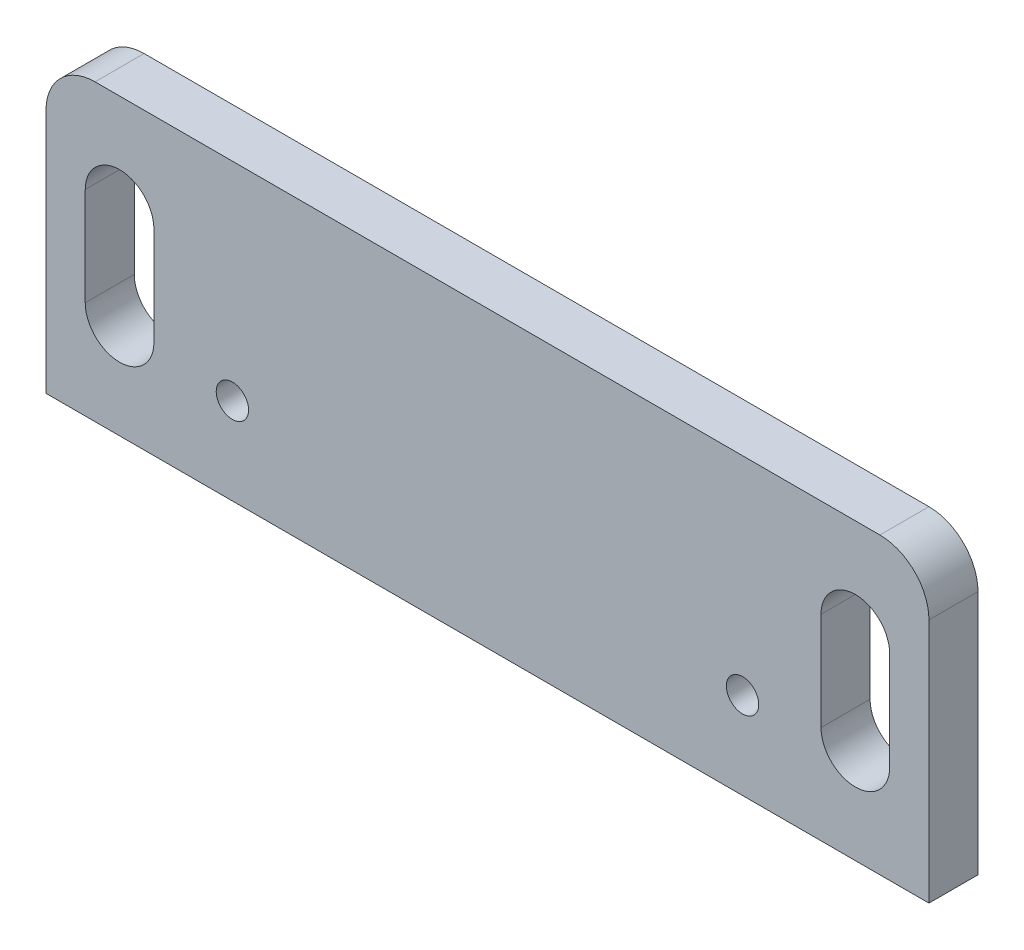
ISO-10303-21;
HEADER;
FILE_DESCRIPTION(('STEP AP214'),'2;1');
FILE_NAME('part.step','',(''),(''),'','','');
FILE_SCHEMA(('AUTOMOTIVE_DESIGN { 1 0 10303 214 1 1 1 1 }'));
ENDSEC;
DATA;
#1=APPLICATION_CONTEXT('core data for automotive mechanical design processes');
#2=APPLICATION_PROTOCOL_DEFINITION('international standard','automotive_design',2000,#1);
#3=PRODUCT_CONTEXT('',#1,'mechanical');
#4=PRODUCT('Part','Part','',(#3));
#5=PRODUCT_RELATED_PRODUCT_CATEGORY('part','',(#4));
#6=PRODUCT_DEFINITION_FORMATION('','',#4);
#7=PRODUCT_DEFINITION_CONTEXT('part definition',#1,'design');
#8=PRODUCT_DEFINITION('design','',#6,#7);
#9=PRODUCT_DEFINITION_SHAPE('','',#8);
#10=(LENGTH_UNIT() NAMED_UNIT(*) SI_UNIT(.MILLI.,.METRE.));
#11=(NAMED_UNIT(*) PLANE_ANGLE_UNIT() SI_UNIT($,.RADIAN.));
#12=(NAMED_UNIT(*) SI_UNIT($,.STERADIAN.) SOLID_ANGLE_UNIT());
#13=UNCERTAINTY_MEASURE_WITH_UNIT(LENGTH_MEASURE(1.E-05),#10,'distance_accuracy_value','');
#14=(GEOMETRIC_REPRESENTATION_CONTEXT(3) GLOBAL_UNCERTAINTY_ASSIGNED_CONTEXT((#13)) GLOBAL_UNIT_ASSIGNED_CONTEXT((#10,
#11,#12)) REPRESENTATION_CONTEXT('',''));
#15=CARTESIAN_POINT('',(0.,0.,0.));
#16=DIRECTION('',(0.,0.,1.));
#17=DIRECTION('',(1.,0.,0.));
#18=AXIS2_PLACEMENT_3D('',#15,#16,#17);
#19=CARTESIAN_POINT('',(-10.1999999999969,25.,1.11022302462516E-12));
#20=DIRECTION('',(0.,0.,-1.));
#21=DIRECTION('',(0.,1.,0.));
#22=AXIS2_PLACEMENT_3D('',#19,#20,#21);
#23=PLANE('',#22);
#24=CARTESIAN_POINT('',(3.79999999999947,8.85000000000002,4.21884749357559E-12));
#25=DIRECTION('',(0.,0.,-1.));
#26=DIRECTION('',(0.,1.,0.));
#27=AXIS2_PLACEMENT_3D('',#24,#25,#26);
#28=CIRCLE('',#27,1.64999999999999);
#29=CARTESIAN_POINT('',(3.79999999999947,10.5,4.2162377947779E-12));
#30=VERTEX_POINT('',#29);
#31=EDGE_CURVE('E215',#30,#30,#28,.F.);
#32=ORIENTED_EDGE('',*,*,#31,.T.);
#33=EDGE_LOOP('',(#32));
#34=FACE_BOUND('',#33,.T.);
#35=CARTESIAN_POINT('',(55.7999999999995,8.84999999999947,4.21884749357559E-12));
#36=DIRECTION('',(0.,0.,-1.));
#37=DIRECTION('',(0.,1.,0.));
#38=AXIS2_PLACEMENT_3D('',#35,#36,#37);
#39=CIRCLE('',#38,1.64999999999999);
#40=CARTESIAN_POINT('',(55.7999999999995,10.4999999999995,4.2162377947779E-12));
#41=VERTEX_POINT('',#40);
#42=EDGE_CURVE('E218',#41,#41,#39,.F.);
#43=ORIENTED_EDGE('',*,*,#42,.T.);
#44=EDGE_LOOP('',(#43));
#45=FACE_BOUND('',#44,.T.);
#46=CARTESIAN_POINT('',(-7.69999999999994,10.0000000000001,5.21284404531031E-12));
#47=DIRECTION('',(0.,0.,-1.));
#48=DIRECTION('',(0.,1.,0.));
#49=AXIS2_PLACEMENT_3D('',#46,#47,#48);
#50=CIRCLE('',#49,3.49999999999997);
#51=CARTESIAN_POINT('',(-11.2,10.0000000000007,5.7203655874638E-12));
#52=VERTEX_POINT('',#51);
#53=CARTESIAN_POINT('',(-4.19999999999998,10.0000000000001,4.71052667358474E-12));
#54=VERTEX_POINT('',#53);
#55=EDGE_CURVE('E221',#52,#54,#50,.F.);
#56=ORIENTED_EDGE('',*,*,#55,.T.);
#57=DIRECTION('',(0.,1.,0.));
#58=VECTOR('',#57,1.);
#59=CARTESIAN_POINT('',(-4.19999999999999,10.,4.21364332314766E-12));
#60=LINE('',#59,#58);
#61=CARTESIAN_POINT('',(-4.19999999999847,20.0000000000001,5.21793329030796E-12));
#62=VERTEX_POINT('',#61);
#63=EDGE_CURVE('E174',#54,#62,#60,.T.);
#64=ORIENTED_EDGE('',*,*,#63,.T.);
#65=CARTESIAN_POINT('',(-7.69999999999694,20.0000000000001,6.22245310832881E-12));
#66=DIRECTION('',(0.,0.,-1.));
#67=DIRECTION('',(0.,1.,0.));
#68=AXIS2_PLACEMENT_3D('',#65,#66,#67);
#69=CIRCLE('',#68,3.49999999999997);
#70=CARTESIAN_POINT('',(-11.2,20.0000000000007,6.22517011897306E-12));
#71=VERTEX_POINT('',#70);
#72=EDGE_CURVE('E173',#62,#71,#69,.F.);
#73=ORIENTED_EDGE('',*,*,#72,.T.);
#74=DIRECTION('',(0.,1.,0.));
#75=VECTOR('',#74,1.);
#76=CARTESIAN_POINT('',(-11.2,10.0000000000025,6.22245310832881E-12));
#77=LINE('',#76,#75);
#78=EDGE_CURVE('E169',#71,#52,#77,.F.);
#79=ORIENTED_EDGE('',*,*,#78,.T.);
#80=EDGE_LOOP('',(#56,#64,#73,#79));
#81=FACE_BOUND('',#80,.T.);
#82=CARTESIAN_POINT('',(67.3000000000019,10.,5.21284404531031E-12));
#83=DIRECTION('',(0.,0.,-1.));
#84=DIRECTION('',(0.,1.,0.));
#85=AXIS2_PLACEMENT_3D('',#82,#83,#84);
#86=CIRCLE('',#85,3.49999999999996);
#87=CARTESIAN_POINT('',(63.8000000000019,10.,5.72025066203352E-12));
#88=VERTEX_POINT('',#87);
#89=CARTESIAN_POINT('',(70.8000000000019,10.,4.71064159901502E-12));
#90=VERTEX_POINT('',#89);
#91=EDGE_CURVE('E227',#88,#90,#86,.F.);
#92=ORIENTED_EDGE('',*,*,#91,.T.);
#93=DIRECTION('',(0.,1.,0.));
#94=VECTOR('',#93,1.);
#95=CARTESIAN_POINT('',(70.800000000002,10.,4.21364332314766E-12));
#96=LINE('',#95,#94);
#97=CARTESIAN_POINT('',(70.8000000000023,20.,4.71573084401267E-12));
#98=VERTEX_POINT('',#97);
#99=EDGE_CURVE('E184',#90,#98,#96,.T.);
#100=ORIENTED_EDGE('',*,*,#99,.T.);
#101=CARTESIAN_POINT('',(67.3000000000031,20.,6.22245310832881E-12));
#102=DIRECTION('',(0.,0.,-1.));
#103=DIRECTION('',(0.,1.,0.));
#104=AXIS2_PLACEMENT_3D('',#101,#102,#103);
#105=CIRCLE('',#104,3.49999999999996);
#106=CARTESIAN_POINT('',(63.8000000000019,20.,6.22517011897306E-12));
#107=VERTEX_POINT('',#106);
#108=EDGE_CURVE('E183',#98,#107,#105,.F.);
#109=ORIENTED_EDGE('',*,*,#108,.T.);
#110=DIRECTION('',(0.,1.,0.));
#111=VECTOR('',#110,1.);
#112=CARTESIAN_POINT('',(63.8000000000018,10.,6.22245310832881E-12));
#113=LINE('',#112,#111);
#114=EDGE_CURVE('E179',#107,#88,#113,.F.);
#115=ORIENTED_EDGE('',*,*,#114,.T.);
#116=EDGE_LOOP('',(#92,#100,#109,#115));
#117=FACE_BOUND('',#116,.T.);
#118=DIRECTION('',(1.,0.,0.));
#119=VECTOR('',#118,1.);
#120=CARTESIAN_POINT('',(-10.2,30.000000000002,-8.88178419700125E-13));
#121=LINE('',#120,#119);
#122=CARTESIAN_POINT('',(-10.1999999999977,30.000000000002,-8.88229380966598E-13));
#123=VERTEX_POINT('',#122);
#124=CARTESIAN_POINT('',(69.8000000000033,30.0000000000021,1.11022302462516E-13));
#125=VERTEX_POINT('',#124);
#126=EDGE_CURVE('E134',#123,#125,#121,.T.);
#127=ORIENTED_EDGE('',*,*,#126,.T.);
#128=CARTESIAN_POINT('',(69.8000000000033,25.0000000000021,1.11802928026705E-12));
#129=DIRECTION('',(0.,0.,-1.));
#130=DIRECTION('',(0.,1.,0.));
#131=AXIS2_PLACEMENT_3D('',#128,#129,#130);
#132=CIRCLE('',#131,4.99999999999998);
#133=CARTESIAN_POINT('',(74.8000000000001,25.0000000000022,1.11024470866861E-12));
#134=VERTEX_POINT('',#133);
#135=EDGE_CURVE('E232',#134,#125,#132,.F.);
#136=ORIENTED_EDGE('',*,*,#135,.F.);
#137=DIRECTION('',(0.,1.,0.));
#138=VECTOR('',#137,1.);
#139=CARTESIAN_POINT('',(74.8000000000001,0.,1.11022302462516E-12));
#140=LINE('',#139,#138);
#141=CARTESIAN_POINT('',(74.8000000000016,1.20761146568859E-13,6.16983316289084E-13));
#142=VERTEX_POINT('',#141);
#143=EDGE_CURVE('E188',#134,#142,#140,.F.);
#144=ORIENTED_EDGE('',*,*,#143,.T.);
#145=DIRECTION('',(1.,0.,0.));
#146=VECTOR('',#145,1.);
#147=CARTESIAN_POINT('',(-15.2,0.,3.70363462121048E-13));
#148=LINE('',#147,#146);
#149=CARTESIAN_POINT('',(-15.2,0.,2.46908974747366E-13));
#150=VERTEX_POINT('',#149);
#151=EDGE_CURVE('E152',#142,#150,#148,.F.);
#152=ORIENTED_EDGE('',*,*,#151,.T.);
#153=DIRECTION('',(0.,1.,0.));
#154=VECTOR('',#153,1.);
#155=CARTESIAN_POINT('',(-15.2,0.,0.));
#156=LINE('',#155,#154);
#157=CARTESIAN_POINT('',(-15.1999999999984,25.0000000000015,-8.72587592459782E-13));
#158=VERTEX_POINT('',#157);
#159=EDGE_CURVE('E147',#150,#158,#156,.T.);
#160=ORIENTED_EDGE('',*,*,#159,.T.);
#161=CARTESIAN_POINT('',(-10.1999999999969,25.0000000000019,-8.8037216405823E-13));
#162=DIRECTION('',(0.,0.,-1.));
#163=DIRECTION('',(0.,1.,0.));
#164=AXIS2_PLACEMENT_3D('',#161,#162,#163);
#165=CIRCLE('',#164,4.99999999999997);
#166=EDGE_CURVE('E45',#123,#158,#165,.F.);
#167=ORIENTED_EDGE('',*,*,#166,.F.);
#168=EDGE_LOOP('',(#127,#136,#144,#152,#160,#167));
#169=FACE_BOUND('',#168,.T.);
#170=ADVANCED_FACE('F42',(#34,#45,#81,#117,#169),#23,.T.);
#171=CARTESIAN_POINT('',(-15.2,0.,4.99999999999989));
#172=DIRECTION('',(1.,0.,0.));
#173=DIRECTION('',(0.,0.,-1.));
#174=AXIS2_PLACEMENT_3D('',#171,#172,#173);
#175=PLANE('',#174);
#176=DIRECTION('',(0.,1.,0.));
#177=VECTOR('',#176,1.);
#178=CARTESIAN_POINT('',(-15.2,25.0000000000019,5.000000000001));
#179=LINE('',#178,#177);
#180=CARTESIAN_POINT('',(-15.2,0.,5.00000000000104));
#181=VERTEX_POINT('',#180);
#182=CARTESIAN_POINT('',(-15.1999999999984,25.0000000000015,5.000000000001));
#183=VERTEX_POINT('',#182);
#184=EDGE_CURVE('E160',#181,#183,#179,.T.);
#185=ORIENTED_EDGE('',*,*,#184,.T.);
#186=DIRECTION('',(0.,0.,-1.));
#187=VECTOR('',#186,1.);
#188=CARTESIAN_POINT('',(-15.1999999999968,25.000000000001,5.00000000000101));
#189=LINE('',#188,#187);
#190=EDGE_CURVE('E143',#158,#183,#189,.F.);
#191=ORIENTED_EDGE('',*,*,#190,.F.);
#192=ORIENTED_EDGE('',*,*,#159,.F.);
#193=DIRECTION('',(0.,0.,1.));
#194=VECTOR('',#193,1.);
#195=CARTESIAN_POINT('',(-15.2,0.,4.99999999999989));
#196=LINE('',#195,#194);
#197=EDGE_CURVE('E166',#150,#181,#196,.T.);
#198=ORIENTED_EDGE('',*,*,#197,.T.);
#199=EDGE_LOOP('',(#185,#191,#192,#198));
#200=FACE_BOUND('',#199,.T.);
#201=ADVANCED_FACE('F158',(#200),#175,.F.);
#202=CARTESIAN_POINT('',(-10.1999999999969,25.0000000000019,5.000000000001));
#203=DIRECTION('',(0.,0.,-1.));
#204=DIRECTION('',(0.,1.,0.));
#205=AXIS2_PLACEMENT_3D('',#202,#203,#204);
#206=CYLINDRICAL_SURFACE('',#205,4.99999999999997);
#207=ORIENTED_EDGE('',*,*,#166,.T.);
#208=ORIENTED_EDGE('',*,*,#190,.T.);
#209=CARTESIAN_POINT('',(-10.1999999999969,25.0000000000019,5.000000000001));
#210=DIRECTION('',(0.,0.,-1.));
#211=DIRECTION('',(0.,1.,0.));
#212=AXIS2_PLACEMENT_3D('',#209,#210,#211);
#213=CIRCLE('',#212,4.99999999999997);
#214=CARTESIAN_POINT('',(-10.1999999999977,30.000000000002,5.00000000000099));
#215=VERTEX_POINT('',#214);
#216=EDGE_CURVE('E213',#183,#215,#213,.T.);
#217=ORIENTED_EDGE('',*,*,#216,.T.);
#218=DIRECTION('',(0.,0.,-1.));
#219=VECTOR('',#218,1.);
#220=CARTESIAN_POINT('',(-10.1999999999984,30.000000000002,4.99999999999901));
#221=LINE('',#220,#219);
#222=EDGE_CURVE('E145',#215,#123,#221,.T.);
#223=ORIENTED_EDGE('',*,*,#222,.T.);
#224=EDGE_LOOP('',(#207,#208,#217,#223));
#225=FACE_BOUND('',#224,.T.);
#226=ADVANCED_FACE('F140',(#225),#206,.T.);
#227=CARTESIAN_POINT('',(-10.2,30.000000000002,4.99999999999901));
#228=DIRECTION('',(0.,-1.,0.));
#229=DIRECTION('',(0.,0.,-1.));
#230=AXIS2_PLACEMENT_3D('',#227,#228,#229);
#231=PLANE('',#230);
#232=DIRECTION('',(1.,0.,0.));
#233=VECTOR('',#232,1.);
#234=CARTESIAN_POINT('',(-10.1999999999969,30.000000000002,5.000000000001));
#235=LINE('',#234,#233);
#236=CARTESIAN_POINT('',(69.8000000000033,30.0000000000021,5.00000000000059));
#237=VERTEX_POINT('',#236);
#238=EDGE_CURVE('E212',#215,#237,#235,.T.);
#239=ORIENTED_EDGE('',*,*,#238,.T.);
#240=DIRECTION('',(0.,0.,-1.));
#241=VECTOR('',#240,1.);
#242=CARTESIAN_POINT('',(69.8000000000033,30.0000000000021,5.000000000001));
#243=LINE('',#242,#241);
#244=EDGE_CURVE('E191',#125,#237,#243,.F.);
#245=ORIENTED_EDGE('',*,*,#244,.F.);
#246=ORIENTED_EDGE('',*,*,#126,.F.);
#247=ORIENTED_EDGE('',*,*,#222,.F.);
#248=EDGE_LOOP('',(#239,#245,#246,#247));
#249=FACE_BOUND('',#248,.T.);
#250=ADVANCED_FACE('F417',(#249),#231,.F.);
#251=CARTESIAN_POINT('',(69.8000000000033,25.0000000000021,5.000000000001));
#252=DIRECTION('',(0.,0.,-1.));
#253=DIRECTION('',(0.,1.,0.));
#254=AXIS2_PLACEMENT_3D('',#251,#252,#253);
#255=CYLINDRICAL_SURFACE('',#254,4.99999999999998);
#256=ORIENTED_EDGE('',*,*,#135,.T.);
#257=ORIENTED_EDGE('',*,*,#244,.T.);
#258=CARTESIAN_POINT('',(69.8000000000033,25.0000000000021,5.00000000000007));
#259=DIRECTION('',(0.,0.,-1.));
#260=DIRECTION('',(0.,1.,0.));
#261=AXIS2_PLACEMENT_3D('',#258,#259,#260);
#262=CIRCLE('',#261,4.99999999999998);
#263=CARTESIAN_POINT('',(74.800000000001,25.0000000000022,5.00000000000006));
#264=VERTEX_POINT('',#263);
#265=EDGE_CURVE('E208',#237,#264,#262,.T.);
#266=ORIENTED_EDGE('',*,*,#265,.T.);
#267=DIRECTION('',(0.,0.,1.));
#268=VECTOR('',#267,1.);
#269=CARTESIAN_POINT('',(74.8000000000001,25.0000000000022,5.00000000000012));
#270=LINE('',#269,#268);
#271=EDGE_CURVE('E190',#264,#134,#270,.F.);
#272=ORIENTED_EDGE('',*,*,#271,.T.);
#273=EDGE_LOOP('',(#256,#257,#266,#272));
#274=FACE_BOUND('',#273,.T.);
#275=ADVANCED_FACE('F407',(#274),#255,.T.);
#276=CARTESIAN_POINT('',(74.8000000000001,0.,5.00000000000012));
#277=DIRECTION('',(-1.,0.,0.));
#278=DIRECTION('',(0.,0.,1.));
#279=AXIS2_PLACEMENT_3D('',#276,#277,#278);
#280=PLANE('',#279);
#281=DIRECTION('',(0.,1.,0.));
#282=VECTOR('',#281,1.);
#283=CARTESIAN_POINT('',(74.8000000000018,25.0000000000019,5.00000000000114));
#284=LINE('',#283,#282);
#285=CARTESIAN_POINT('',(74.800000000002,0.,5.00000000000118));
#286=VERTEX_POINT('',#285);
#287=EDGE_CURVE('E211',#264,#286,#284,.F.);
#288=ORIENTED_EDGE('',*,*,#287,.T.);
#289=DIRECTION('',(0.,0.,1.));
#290=VECTOR('',#289,1.);
#291=CARTESIAN_POINT('',(74.8000000000023,1.28669324743698E-13,4.99999999999989));
#292=LINE('',#291,#290);
#293=EDGE_CURVE('E168',#286,#142,#292,.F.);
#294=ORIENTED_EDGE('',*,*,#293,.T.);
#295=ORIENTED_EDGE('',*,*,#143,.F.);
#296=ORIENTED_EDGE('',*,*,#271,.F.);
#297=EDGE_LOOP('',(#288,#294,#295,#296));
#298=FACE_BOUND('',#297,.T.);
#299=ADVANCED_FACE('F397',(#298),#280,.F.);
#300=CARTESIAN_POINT('',(-15.2,0.,4.99999999999989));
#301=DIRECTION('',(0.,1.,0.));
#302=DIRECTION('',(0.,0.,1.));
#303=AXIS2_PLACEMENT_3D('',#300,#301,#302);
#304=PLANE('',#303);
#305=DIRECTION('',(1.,0.,0.));
#306=VECTOR('',#305,1.);
#307=CARTESIAN_POINT('',(-10.1999999999969,0.,5.00000000000104));
#308=LINE('',#307,#306);
#309=EDGE_CURVE('E240',#286,#181,#308,.F.);
#310=ORIENTED_EDGE('',*,*,#309,.T.);
#311=ORIENTED_EDGE('',*,*,#197,.F.);
#312=ORIENTED_EDGE('',*,*,#151,.F.);
#313=ORIENTED_EDGE('',*,*,#293,.F.);
#314=EDGE_LOOP('',(#310,#311,#312,#313));
#315=FACE_BOUND('',#314,.T.);
#316=ADVANCED_FACE('F387',(#315),#304,.F.);
#317=CARTESIAN_POINT('',(70.800000000002,10.,5.00000000000411));
#318=DIRECTION('',(1.,0.,0.));
#319=DIRECTION('',(0.,0.,-1.));
#320=AXIS2_PLACEMENT_3D('',#317,#318,#319);
#321=PLANE('',#320);
#322=DIRECTION('',(0.,1.,0.));
#323=VECTOR('',#322,1.);
#324=CARTESIAN_POINT('',(70.800000000002,25.0000000000019,5.00000000000113));
#325=LINE('',#324,#323);
#326=CARTESIAN_POINT('',(70.8000000000019,10.,5.00000000000189));
#327=VERTEX_POINT('',#326);
#328=CARTESIAN_POINT('',(70.8000000000028,19.9999999999999,5.00000000000362));
#329=VERTEX_POINT('',#328);
#330=EDGE_CURVE('E207',#327,#329,#325,.T.);
#331=ORIENTED_EDGE('',*,*,#330,.T.);
#332=DIRECTION('',(0.,0.,-1.));
#333=VECTOR('',#332,1.);
#334=CARTESIAN_POINT('',(70.8000000000031,19.9999999999999,5.00000000000611));
#335=LINE('',#334,#333);
#336=EDGE_CURVE('E187',#329,#98,#335,.T.);
#337=ORIENTED_EDGE('',*,*,#336,.T.);
#338=ORIENTED_EDGE('',*,*,#99,.F.);
#339=DIRECTION('',(0.,0.,-1.));
#340=VECTOR('',#339,1.);
#341=CARTESIAN_POINT('',(70.8000000000019,10.,5.00000000000411));
#342=LINE('',#341,#340);
#343=EDGE_CURVE('E230',#90,#327,#342,.F.);
#344=ORIENTED_EDGE('',*,*,#343,.T.);
#345=EDGE_LOOP('',(#331,#337,#338,#344));
#346=FACE_BOUND('',#345,.T.);
#347=ADVANCED_FACE('F377',(#346),#321,.F.);
#348=CARTESIAN_POINT('',(67.3000000000031,20.,5.00000000000611));
#349=DIRECTION('',(0.,0.,-1.));
#350=DIRECTION('',(0.,1.,0.));
#351=AXIS2_PLACEMENT_3D('',#348,#349,#350);
#352=CYLINDRICAL_SURFACE('',#351,3.49999999999996);
#353=CARTESIAN_POINT('',(67.3000000000031,20.,5.00000000000611));
#354=DIRECTION('',(0.,0.,-1.));
#355=DIRECTION('',(0.,1.,0.));
#356=AXIS2_PLACEMENT_3D('',#353,#354,#355);
#357=CIRCLE('',#356,3.49999999999996);
#358=CARTESIAN_POINT('',(63.8000000000021,20.,5.00000000000237));
#359=VERTEX_POINT('',#358);
#360=EDGE_CURVE('E205',#329,#359,#357,.F.);
#361=ORIENTED_EDGE('',*,*,#360,.T.);
#362=DIRECTION('',(0.,0.,1.));
#363=VECTOR('',#362,1.);
#364=CARTESIAN_POINT('',(63.8000000000019,20.,5.00000000000411));
#365=LINE('',#364,#363);
#366=EDGE_CURVE('E182',#359,#107,#365,.F.);
#367=ORIENTED_EDGE('',*,*,#366,.T.);
#368=ORIENTED_EDGE('',*,*,#108,.F.);
#369=ORIENTED_EDGE('',*,*,#336,.F.);
#370=EDGE_LOOP('',(#361,#367,#368,#369));
#371=FACE_BOUND('',#370,.T.);
#372=ADVANCED_FACE('F367',(#371),#352,.F.);
#373=CARTESIAN_POINT('',(63.8000000000019,10.,5.00000000000411));
#374=DIRECTION('',(-1.,0.,0.));
#375=DIRECTION('',(0.,0.,1.));
#376=AXIS2_PLACEMENT_3D('',#373,#374,#375);
#377=PLANE('',#376);
#378=DIRECTION('',(0.,1.,0.));
#379=VECTOR('',#378,1.);
#380=CARTESIAN_POINT('',(63.8000000000028,25.0000000000019,5.00000000000112));
#381=LINE('',#380,#379);
#382=CARTESIAN_POINT('',(63.8000000000026,10.,5.00000000000189));
#383=VERTEX_POINT('',#382);
#384=EDGE_CURVE('E204',#359,#383,#381,.F.);
#385=ORIENTED_EDGE('',*,*,#384,.T.);
#386=DIRECTION('',(0.,0.,-1.));
#387=VECTOR('',#386,1.);
#388=CARTESIAN_POINT('',(63.800000000002,10.,5.00000000000412));
#389=LINE('',#388,#387);
#390=EDGE_CURVE('E178',#383,#88,#389,.T.);
#391=ORIENTED_EDGE('',*,*,#390,.T.);
#392=ORIENTED_EDGE('',*,*,#114,.F.);
#393=ORIENTED_EDGE('',*,*,#366,.F.);
#394=EDGE_LOOP('',(#385,#391,#392,#393));
#395=FACE_BOUND('',#394,.T.);
#396=ADVANCED_FACE('F295',(#395),#377,.F.);
#397=CARTESIAN_POINT('',(67.3000000000019,10.,5.00000000000411));
#398=DIRECTION('',(0.,0.,-1.));
#399=DIRECTION('',(0.,1.,0.));
#400=AXIS2_PLACEMENT_3D('',#397,#398,#399);
#401=CYLINDRICAL_SURFACE('',#400,3.49999999999996);
#402=CARTESIAN_POINT('',(67.3000000000019,10.,5.00000000000264));
#403=DIRECTION('',(0.,0.,-1.));
#404=DIRECTION('',(0.,1.,0.));
#405=AXIS2_PLACEMENT_3D('',#402,#403,#404);
#406=CIRCLE('',#405,3.49999999999996);
#407=EDGE_CURVE('E201',#383,#327,#406,.F.);
#408=ORIENTED_EDGE('',*,*,#407,.T.);
#409=ORIENTED_EDGE('',*,*,#343,.F.);
#410=ORIENTED_EDGE('',*,*,#91,.F.);
#411=ORIENTED_EDGE('',*,*,#390,.F.);
#412=EDGE_LOOP('',(#408,#409,#410,#411));
#413=FACE_BOUND('',#412,.T.);
#414=ADVANCED_FACE('F288',(#413),#401,.F.);
#415=CARTESIAN_POINT('',(-4.19999999999998,10.,5.00000000000411));
#416=DIRECTION('',(1.,0.,0.));
#417=DIRECTION('',(0.,0.,-1.));
#418=AXIS2_PLACEMENT_3D('',#415,#416,#417);
#419=PLANE('',#418);
#420=DIRECTION('',(0.,1.,0.));
#421=VECTOR('',#420,1.);
#422=CARTESIAN_POINT('',(-4.19999999999998,25.0000000000019,5.00000000000101));
#423=LINE('',#422,#421);
#424=CARTESIAN_POINT('',(-4.19999999999998,10.0000000000001,5.00000000000181));
#425=VERTEX_POINT('',#424);
#426=CARTESIAN_POINT('',(-4.19999999999923,20.0000000000001,5.00000000000356));
#427=VERTEX_POINT('',#426);
#428=EDGE_CURVE('E200',#425,#427,#423,.T.);
#429=ORIENTED_EDGE('',*,*,#428,.T.);
#430=DIRECTION('',(0.,0.,-1.));
#431=VECTOR('',#430,1.);
#432=CARTESIAN_POINT('',(-4.19999999999696,20.0000000000001,5.00000000000611));
#433=LINE('',#432,#431);
#434=EDGE_CURVE('E177',#427,#62,#433,.T.);
#435=ORIENTED_EDGE('',*,*,#434,.T.);
#436=ORIENTED_EDGE('',*,*,#63,.F.);
#437=DIRECTION('',(0.,0.,-1.));
#438=VECTOR('',#437,1.);
#439=CARTESIAN_POINT('',(-4.19999999999996,10.0000000000001,5.00000000000411));
#440=LINE('',#439,#438);
#441=EDGE_CURVE('E224',#54,#425,#440,.F.);
#442=ORIENTED_EDGE('',*,*,#441,.T.);
#443=EDGE_LOOP('',(#429,#435,#436,#442));
#444=FACE_BOUND('',#443,.T.);
#445=ADVANCED_FACE('F286',(#444),#419,.F.);
#446=CARTESIAN_POINT('',(-7.69999999999693,20.0000000000001,5.00000000000611));
#447=DIRECTION('',(0.,0.,-1.));
#448=DIRECTION('',(0.,1.,0.));
#449=AXIS2_PLACEMENT_3D('',#446,#447,#448);
#450=CYLINDRICAL_SURFACE('',#449,3.49999999999997);
#451=CARTESIAN_POINT('',(-7.69999999999693,20.0000000000001,5.00000000000611));
#452=DIRECTION('',(0.,0.,-1.));
#453=DIRECTION('',(0.,1.,0.));
#454=AXIS2_PLACEMENT_3D('',#451,#452,#453);
#455=CIRCLE('',#454,3.49999999999997);
#456=CARTESIAN_POINT('',(-11.1999999999982,20.0000000000007,5.00000000000229));
#457=VERTEX_POINT('',#456);
#458=EDGE_CURVE('E198',#427,#457,#455,.F.);
#459=ORIENTED_EDGE('',*,*,#458,.T.);
#460=DIRECTION('',(0.,0.,1.));
#461=VECTOR('',#460,1.);
#462=CARTESIAN_POINT('',(-11.2,20.0000000000013,5.00000000000411));
#463=LINE('',#462,#461);
#464=EDGE_CURVE('E172',#457,#71,#463,.F.);
#465=ORIENTED_EDGE('',*,*,#464,.T.);
#466=ORIENTED_EDGE('',*,*,#72,.F.);
#467=ORIENTED_EDGE('',*,*,#434,.F.);
#468=EDGE_LOOP('',(#459,#465,#466,#467));
#469=FACE_BOUND('',#468,.T.);
#470=ADVANCED_FACE('F285',(#469),#450,.F.);
#471=CARTESIAN_POINT('',(-11.2,10.0000000000025,5.00000000000411));
#472=DIRECTION('',(-1.,0.,0.));
#473=DIRECTION('',(0.,0.,1.));
#474=AXIS2_PLACEMENT_3D('',#471,#472,#473);
#475=PLANE('',#474);
#476=DIRECTION('',(0.,1.,0.));
#477=VECTOR('',#476,1.);
#478=CARTESIAN_POINT('',(-11.1999999999977,25.0000000000019,5.000000000001));
#479=LINE('',#478,#477);
#480=CARTESIAN_POINT('',(-11.1999999999988,10.0000000000007,5.00000000000259));
#481=VERTEX_POINT('',#480);
#482=EDGE_CURVE('E197',#457,#481,#479,.F.);
#483=ORIENTED_EDGE('',*,*,#482,.T.);
#484=DIRECTION('',(0.,0.,-1.));
#485=VECTOR('',#484,1.);
#486=CARTESIAN_POINT('',(-11.1999999999999,10.0000000000013,5.00000000000412));
#487=LINE('',#486,#485);
#488=EDGE_CURVE('E60',#481,#52,#487,.T.);
#489=ORIENTED_EDGE('',*,*,#488,.T.);
#490=ORIENTED_EDGE('',*,*,#78,.F.);
#491=ORIENTED_EDGE('',*,*,#464,.F.);
#492=EDGE_LOOP('',(#483,#489,#490,#491));
#493=FACE_BOUND('',#492,.T.);
#494=ADVANCED_FACE('F274',(#493),#475,.F.);
#495=CARTESIAN_POINT('',(-7.69999999999993,10.0000000000001,5.00000000000411));
#496=DIRECTION('',(0.,0.,-1.));
#497=DIRECTION('',(0.,1.,0.));
#498=AXIS2_PLACEMENT_3D('',#495,#496,#497);
#499=CYLINDRICAL_SURFACE('',#498,3.49999999999997);
#500=CARTESIAN_POINT('',(-7.69999999999993,10.0000000000001,5.00000000000258));
#501=DIRECTION('',(0.,0.,-1.));
#502=DIRECTION('',(0.,1.,0.));
#503=AXIS2_PLACEMENT_3D('',#500,#501,#502);
#504=CIRCLE('',#503,3.49999999999997);
#505=EDGE_CURVE('E195',#481,#425,#504,.F.);
#506=ORIENTED_EDGE('',*,*,#505,.T.);
#507=ORIENTED_EDGE('',*,*,#441,.F.);
#508=ORIENTED_EDGE('',*,*,#55,.F.);
#509=ORIENTED_EDGE('',*,*,#488,.F.);
#510=EDGE_LOOP('',(#506,#507,#508,#509));
#511=FACE_BOUND('',#510,.T.);
#512=ADVANCED_FACE('F280',(#511),#499,.F.);
#513=CARTESIAN_POINT('',(55.7999999999995,8.84999999999947,4.21884749357559E-12));
#514=DIRECTION('',(0.,0.,-1.));
#515=DIRECTION('',(0.,1.,0.));
#516=AXIS2_PLACEMENT_3D('',#513,#514,#515);
#517=CYLINDRICAL_SURFACE('',#516,1.64999999999999);
#518=ORIENTED_EDGE('',*,*,#42,.F.);
#519=EDGE_LOOP('',(#518));
#520=FACE_BOUND('',#519,.T.);
#521=CARTESIAN_POINT('',(55.7999999999995,8.84999999999948,5.00000000000411));
#522=DIRECTION('',(0.,0.,-1.));
#523=DIRECTION('',(0.,1.,0.));
#524=AXIS2_PLACEMENT_3D('',#521,#522,#523);
#525=CIRCLE('',#524,1.64999999999999);
#526=CARTESIAN_POINT('',(55.7999999999995,10.4999999999995,5.00000000000411));
#527=VERTEX_POINT('',#526);
#528=EDGE_CURVE('E51',#527,#527,#525,.F.);
#529=ORIENTED_EDGE('',*,*,#528,.T.);
#530=EDGE_LOOP('',(#529));
#531=FACE_BOUND('',#530,.T.);
#532=ADVANCED_FACE('F305',(#520,#531),#517,.F.);
#533=CARTESIAN_POINT('',(3.79999999999947,8.85000000000002,4.21884749357559E-12));
#534=DIRECTION('',(0.,0.,-1.));
#535=DIRECTION('',(0.,1.,0.));
#536=AXIS2_PLACEMENT_3D('',#533,#534,#535);
#537=CYLINDRICAL_SURFACE('',#536,1.64999999999999);
#538=ORIENTED_EDGE('',*,*,#31,.F.);
#539=EDGE_LOOP('',(#538));
#540=FACE_BOUND('',#539,.T.);
#541=CARTESIAN_POINT('',(3.79999999999948,8.85000000000003,5.00000000000411));
#542=DIRECTION('',(0.,0.,-1.));
#543=DIRECTION('',(0.,1.,0.));
#544=AXIS2_PLACEMENT_3D('',#541,#542,#543);
#545=CIRCLE('',#544,1.64999999999999);
#546=CARTESIAN_POINT('',(3.79999999999948,10.5,5.00000000000411));
#547=VERTEX_POINT('',#546);
#548=EDGE_CURVE('E11',#547,#547,#545,.F.);
#549=ORIENTED_EDGE('',*,*,#548,.T.);
#550=EDGE_LOOP('',(#549));
#551=FACE_BOUND('',#550,.T.);
#552=ADVANCED_FACE('F299',(#540,#551),#537,.F.);
#553=CARTESIAN_POINT('',(-10.1999999999969,25.0000000000019,5.000000000001));
#554=DIRECTION('',(0.,0.,-1.));
#555=DIRECTION('',(0.,1.,0.));
#556=AXIS2_PLACEMENT_3D('',#553,#554,#555);
#557=PLANE('',#556);
#558=ORIENTED_EDGE('',*,*,#548,.F.);
#559=EDGE_LOOP('',(#558));
#560=FACE_BOUND('',#559,.T.);
#561=ORIENTED_EDGE('',*,*,#528,.F.);
#562=EDGE_LOOP('',(#561));
#563=FACE_BOUND('',#562,.T.);
#564=ORIENTED_EDGE('',*,*,#482,.F.);
#565=ORIENTED_EDGE('',*,*,#458,.F.);
#566=ORIENTED_EDGE('',*,*,#428,.F.);
#567=ORIENTED_EDGE('',*,*,#505,.F.);
#568=EDGE_LOOP('',(#564,#565,#566,#567));
#569=FACE_BOUND('',#568,.T.);
#570=ORIENTED_EDGE('',*,*,#384,.F.);
#571=ORIENTED_EDGE('',*,*,#360,.F.);
#572=ORIENTED_EDGE('',*,*,#330,.F.);
#573=ORIENTED_EDGE('',*,*,#407,.F.);
#574=EDGE_LOOP('',(#570,#571,#572,#573));
#575=FACE_BOUND('',#574,.T.);
#576=ORIENTED_EDGE('',*,*,#287,.F.);
#577=ORIENTED_EDGE('',*,*,#265,.F.);
#578=ORIENTED_EDGE('',*,*,#238,.F.);
#579=ORIENTED_EDGE('',*,*,#216,.F.);
#580=ORIENTED_EDGE('',*,*,#184,.F.);
#581=ORIENTED_EDGE('',*,*,#309,.F.);
#582=EDGE_LOOP('',(#576,#577,#578,#579,#580,#581));
#583=FACE_BOUND('',#582,.T.);
#584=ADVANCED_FACE('F277',(#560,#563,#569,#575,#583),#557,.F.);
#585=CLOSED_SHELL('',(#170,#201,#226,#250,#275,#299,#316,#347,#372,#396,#414,#445,#470,#494,
#512,#532,#552,#584));
#586=MANIFOLD_SOLID_BREP('B2',#585);
#587=ADVANCED_BREP_SHAPE_REPRESENTATION('',(#18,#586),#14);
#588=SHAPE_DEFINITION_REPRESENTATION(#9,#587);
ENDSEC;
END-ISO-10303-21;
